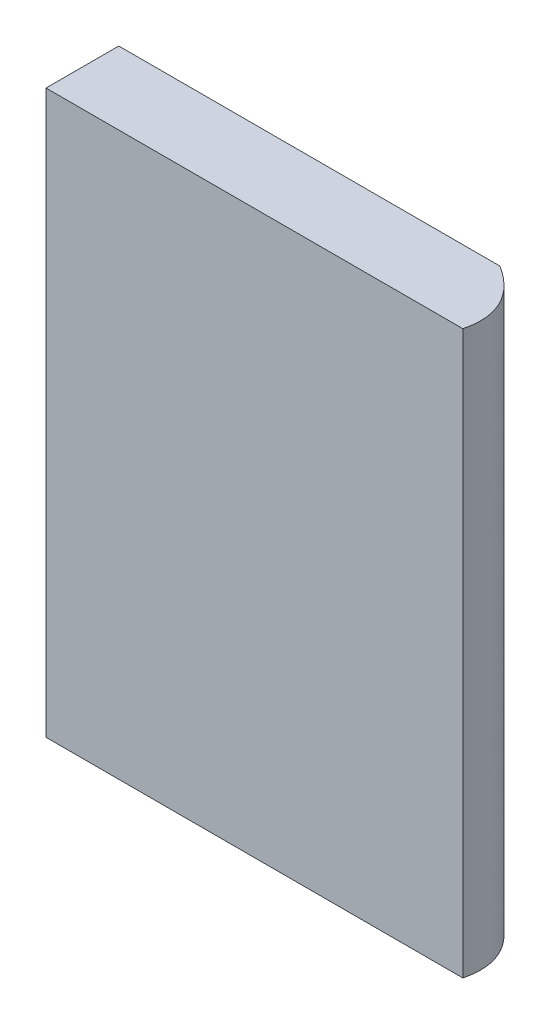
ISO-10303-21;
HEADER;
FILE_DESCRIPTION(('STEP AP214'),'2;1');
FILE_NAME('part.step','',(''),(''),'','','');
FILE_SCHEMA(('AUTOMOTIVE_DESIGN { 1 0 10303 214 1 1 1 1 }'));
ENDSEC;
DATA;
#1=APPLICATION_CONTEXT('core data for automotive mechanical design processes');
#2=APPLICATION_PROTOCOL_DEFINITION('international standard','automotive_design',2000,#1);
#3=PRODUCT_CONTEXT('',#1,'mechanical');
#4=PRODUCT('Part','Part','',(#3));
#5=PRODUCT_RELATED_PRODUCT_CATEGORY('part','',(#4));
#6=PRODUCT_DEFINITION_FORMATION('','',#4);
#7=PRODUCT_DEFINITION_CONTEXT('part definition',#1,'design');
#8=PRODUCT_DEFINITION('design','',#6,#7);
#9=PRODUCT_DEFINITION_SHAPE('','',#8);
#10=(LENGTH_UNIT() NAMED_UNIT(*) SI_UNIT(.MILLI.,.METRE.));
#11=(NAMED_UNIT(*) PLANE_ANGLE_UNIT() SI_UNIT($,.RADIAN.));
#12=(NAMED_UNIT(*) SI_UNIT($,.STERADIAN.) SOLID_ANGLE_UNIT());
#13=UNCERTAINTY_MEASURE_WITH_UNIT(LENGTH_MEASURE(1.E-05),#10,'distance_accuracy_value','');
#14=(GEOMETRIC_REPRESENTATION_CONTEXT(3) GLOBAL_UNCERTAINTY_ASSIGNED_CONTEXT((#13)) GLOBAL_UNIT_ASSIGNED_CONTEXT((#10,
#11,#12)) REPRESENTATION_CONTEXT('',''));
#15=CARTESIAN_POINT('',(0.,0.,0.));
#16=DIRECTION('',(0.,0.,1.));
#17=DIRECTION('',(1.,0.,0.));
#18=AXIS2_PLACEMENT_3D('',#15,#16,#17);
#19=CARTESIAN_POINT('',(-9.8895273624505,0.,29.2716498296639));
#20=CARTESIAN_POINT('',(32.2081101978187,0.,-0.156276991708373));
#21=CARTESIAN_POINT('',(-21.6770448247652,0.,-6.89005628353885));
#22=B_SPLINE_CURVE_WITH_KNOTS('',2,(#19,#20,#21),.UNSPECIFIED.,.F.,.F.,(3,3),(0.,1.),.UNSPECIFIED.);
#23=DIRECTION('',(0.,1.,0.));
#24=VECTOR('',#23,1.);
#25=SURFACE_OF_LINEAR_EXTRUSION('',#22,#24);
#26=DIRECTION('',(0.,1.,0.));
#27=VECTOR('',#26,1.);
#28=CARTESIAN_POINT('',(8.29260324405748,0.,10.));
#29=LINE('',#28,#27);
#30=CARTESIAN_POINT('',(8.29260324405748,-39.2569848371862,10.));
#31=VERTEX_POINT('',#30);
#32=CARTESIAN_POINT('',(8.29260324405748,38.0205443698732,10.));
#33=VERTEX_POINT('',#32);
#34=EDGE_CURVE('E74',#31,#33,#29,.T.);
#35=ORIENTED_EDGE('',*,*,#34,.F.);
#36=CARTESIAN_POINT('',(-9.8895273624505,-39.2569848371862,29.2716498296639));
#37=CARTESIAN_POINT('',(32.2081101978187,-39.2569848371862,-0.156276991708373));
#38=CARTESIAN_POINT('',(-21.6770448247652,-39.2569848371862,-6.89005628353885));
#39=B_SPLINE_CURVE_WITH_KNOTS('',2,(#36,#37,#38),.UNSPECIFIED.,.F.,.F.,(3,3),(0.,1.),.UNSPECIFIED.);
#40=CARTESIAN_POINT('',(3.39449881879197,-39.2569848371862,0.));
#41=VERTEX_POINT('',#40);
#42=EDGE_CURVE('E93',#31,#41,#39,.T.);
#43=ORIENTED_EDGE('',*,*,#42,.T.);
#44=DIRECTION('',(0.,1.,0.));
#45=VECTOR('',#44,1.);
#46=CARTESIAN_POINT('',(3.39449881879198,0.,0.));
#47=LINE('',#46,#45);
#48=CARTESIAN_POINT('',(3.39449881879197,38.0205443698732,0.));
#49=VERTEX_POINT('',#48);
#50=EDGE_CURVE('E86',#41,#49,#47,.T.);
#51=ORIENTED_EDGE('',*,*,#50,.T.);
#52=CARTESIAN_POINT('',(-9.8895273624505,38.0205443698732,29.2716498296639));
#53=CARTESIAN_POINT('',(32.2081101978187,38.0205443698732,-0.156276991708373));
#54=CARTESIAN_POINT('',(-21.6770448247652,38.0205443698732,-6.89005628353885));
#55=B_SPLINE_CURVE_WITH_KNOTS('',2,(#52,#53,#54),.UNSPECIFIED.,.F.,.F.,(3,3),(0.,1.),.UNSPECIFIED.);
#56=EDGE_CURVE('E91',#49,#33,#55,.F.);
#57=ORIENTED_EDGE('',*,*,#56,.T.);
#58=EDGE_LOOP('',(#35,#43,#51,#57));
#59=FACE_BOUND('',#58,.T.);
#60=ADVANCED_FACE('F34',(#59),#25,.T.);
#61=CARTESIAN_POINT('',(-48.9939535172757,-39.2569848371862,10.));
#62=DIRECTION('',(0.,1.,0.));
#63=DIRECTION('',(0.,0.,1.));
#64=AXIS2_PLACEMENT_3D('',#61,#62,#63);
#65=PLANE('',#64);
#66=ORIENTED_EDGE('',*,*,#42,.F.);
#67=DIRECTION('',(1.,0.,0.));
#68=VECTOR('',#67,1.);
#69=CARTESIAN_POINT('',(-48.9939535172757,-39.2569848371862,10.));
#70=LINE('',#69,#68);
#71=CARTESIAN_POINT('',(-48.9939535172757,-39.2569848371862,10.));
#72=VERTEX_POINT('',#71);
#73=EDGE_CURVE('E101',#72,#31,#70,.T.);
#74=ORIENTED_EDGE('',*,*,#73,.F.);
#75=DIRECTION('',(0.,0.,-1.));
#76=VECTOR('',#75,1.);
#77=CARTESIAN_POINT('',(-48.9939535172757,-39.2569848371862,10.));
#78=LINE('',#77,#76);
#79=CARTESIAN_POINT('',(-48.9939535172757,-39.2569848371862,0.));
#80=VERTEX_POINT('',#79);
#81=EDGE_CURVE('E107',#72,#80,#78,.T.);
#82=ORIENTED_EDGE('',*,*,#81,.T.);
#83=DIRECTION('',(1.,0.,0.));
#84=VECTOR('',#83,1.);
#85=CARTESIAN_POINT('',(-48.9939535172757,-39.2569848371862,0.));
#86=LINE('',#85,#84);
#87=EDGE_CURVE('E46',#80,#41,#86,.T.);
#88=ORIENTED_EDGE('',*,*,#87,.T.);
#89=EDGE_LOOP('',(#66,#74,#82,#88));
#90=FACE_BOUND('',#89,.T.);
#91=ADVANCED_FACE('F105',(#90),#65,.F.);
#92=CARTESIAN_POINT('',(-48.9939535172757,38.0205443698732,10.));
#93=DIRECTION('',(0.,-1.,0.));
#94=DIRECTION('',(0.,0.,-1.));
#95=AXIS2_PLACEMENT_3D('',#92,#93,#94);
#96=PLANE('',#95);
#97=ORIENTED_EDGE('',*,*,#56,.F.);
#98=DIRECTION('',(-1.,0.,0.));
#99=VECTOR('',#98,1.);
#100=CARTESIAN_POINT('',(-48.9939535172757,38.0205443698732,0.));
#101=LINE('',#100,#99);
#102=CARTESIAN_POINT('',(-48.9939535172757,38.0205443698732,0.));
#103=VERTEX_POINT('',#102);
#104=EDGE_CURVE('E82',#49,#103,#101,.T.);
#105=ORIENTED_EDGE('',*,*,#104,.T.);
#106=DIRECTION('',(0.,0.,-1.));
#107=VECTOR('',#106,1.);
#108=CARTESIAN_POINT('',(-48.9939535172757,38.0205443698732,10.));
#109=LINE('',#108,#107);
#110=CARTESIAN_POINT('',(-48.9939535172757,38.0205443698732,10.));
#111=VERTEX_POINT('',#110);
#112=EDGE_CURVE('E102',#111,#103,#109,.T.);
#113=ORIENTED_EDGE('',*,*,#112,.F.);
#114=DIRECTION('',(-1.,0.,0.));
#115=VECTOR('',#114,1.);
#116=CARTESIAN_POINT('',(-48.9939535172757,38.0205443698732,10.));
#117=LINE('',#116,#115);
#118=EDGE_CURVE('E66',#33,#111,#117,.T.);
#119=ORIENTED_EDGE('',*,*,#118,.F.);
#120=EDGE_LOOP('',(#97,#105,#113,#119));
#121=FACE_BOUND('',#120,.T.);
#122=ADVANCED_FACE('F92',(#121),#96,.F.);
#123=CARTESIAN_POINT('',(0.,0.,10.));
#124=DIRECTION('',(0.,0.,1.));
#125=DIRECTION('',(1.,0.,0.));
#126=AXIS2_PLACEMENT_3D('',#123,#124,#125);
#127=PLANE('',#126);
#128=ORIENTED_EDGE('',*,*,#73,.T.);
#129=ORIENTED_EDGE('',*,*,#34,.T.);
#130=ORIENTED_EDGE('',*,*,#118,.T.);
#131=DIRECTION('',(0.,-1.,0.));
#132=VECTOR('',#131,1.);
#133=CARTESIAN_POINT('',(-48.9939535172757,38.0205443698732,10.));
#134=LINE('',#133,#132);
#135=EDGE_CURVE('E89',#111,#72,#134,.T.);
#136=ORIENTED_EDGE('',*,*,#135,.T.);
#137=EDGE_LOOP('',(#128,#129,#130,#136));
#138=FACE_BOUND('',#137,.T.);
#139=ADVANCED_FACE('F36',(#138),#127,.T.);
#140=CARTESIAN_POINT('',(0.,0.,0.));
#141=DIRECTION('',(0.,0.,1.));
#142=DIRECTION('',(1.,0.,0.));
#143=AXIS2_PLACEMENT_3D('',#140,#141,#142);
#144=PLANE('',#143);
#145=ORIENTED_EDGE('',*,*,#50,.F.);
#146=ORIENTED_EDGE('',*,*,#87,.F.);
#147=DIRECTION('',(0.,-1.,0.));
#148=VECTOR('',#147,1.);
#149=CARTESIAN_POINT('',(-48.9939535172757,38.0205443698732,0.));
#150=LINE('',#149,#148);
#151=EDGE_CURVE('E11',#103,#80,#150,.T.);
#152=ORIENTED_EDGE('',*,*,#151,.F.);
#153=ORIENTED_EDGE('',*,*,#104,.F.);
#154=EDGE_LOOP('',(#145,#146,#152,#153));
#155=FACE_BOUND('',#154,.T.);
#156=ADVANCED_FACE('F84',(#155),#144,.F.);
#157=CARTESIAN_POINT('',(-48.9939535172757,38.0205443698732,10.));
#158=DIRECTION('',(1.,0.,0.));
#159=DIRECTION('',(0.,0.,-1.));
#160=AXIS2_PLACEMENT_3D('',#157,#158,#159);
#161=PLANE('',#160);
#162=ORIENTED_EDGE('',*,*,#151,.T.);
#163=ORIENTED_EDGE('',*,*,#81,.F.);
#164=ORIENTED_EDGE('',*,*,#135,.F.);
#165=ORIENTED_EDGE('',*,*,#112,.T.);
#166=EDGE_LOOP('',(#162,#163,#164,#165));
#167=FACE_BOUND('',#166,.T.);
#168=ADVANCED_FACE('F111',(#167),#161,.F.);
#169=CLOSED_SHELL('',(#60,#91,#122,#139,#156,#168));
#170=MANIFOLD_SOLID_BREP('B2',#169);
#171=ADVANCED_BREP_SHAPE_REPRESENTATION('',(#18,#170),#14);
#172=SHAPE_DEFINITION_REPRESENTATION(#9,#171);
ENDSEC;
END-ISO-10303-21;
